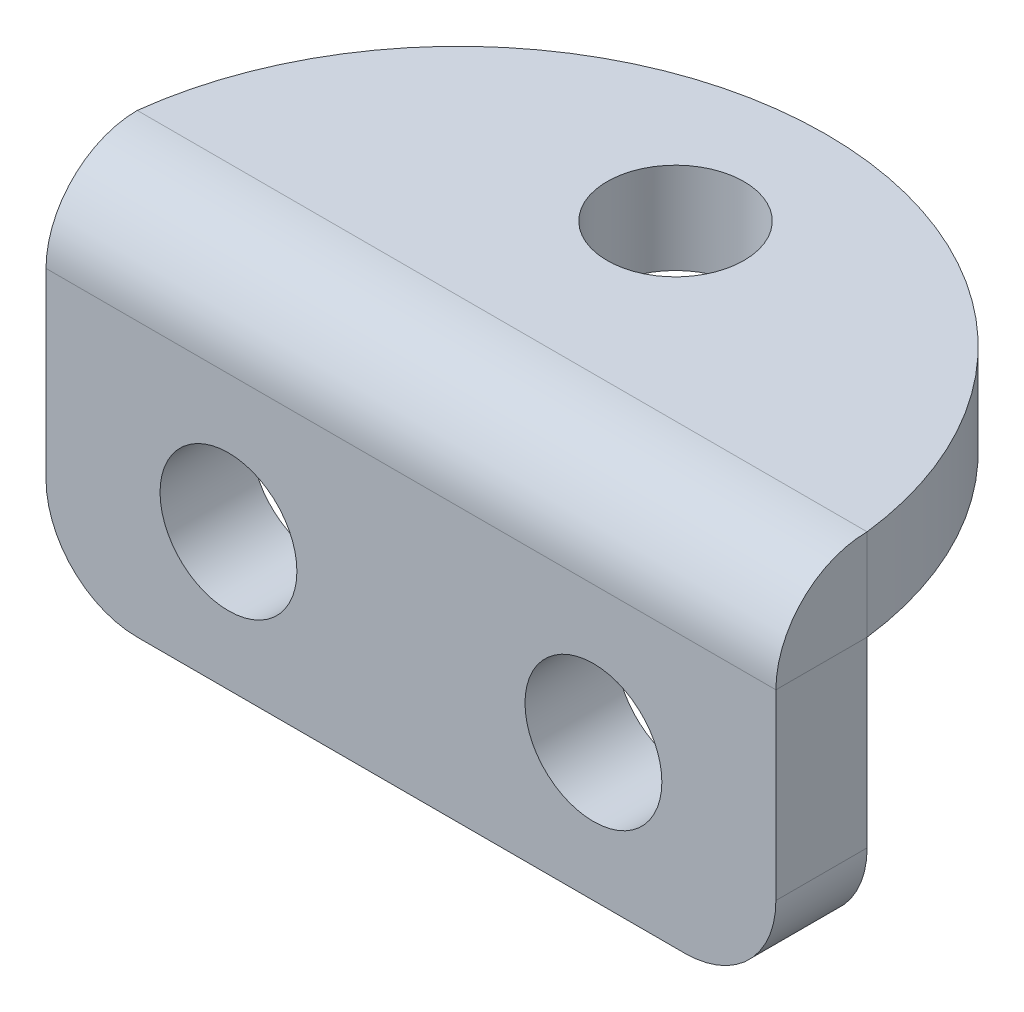
ISO-10303-21;
HEADER;
FILE_DESCRIPTION(('STEP AP214'),'2;1');
FILE_NAME('part.step','',(''),(''),'','','');
FILE_SCHEMA(('AUTOMOTIVE_DESIGN { 1 0 10303 214 1 1 1 1 }'));
ENDSEC;
DATA;
#1=APPLICATION_CONTEXT('core data for automotive mechanical design processes');
#2=APPLICATION_PROTOCOL_DEFINITION('international standard','automotive_design',2000,#1);
#3=PRODUCT_CONTEXT('',#1,'mechanical');
#4=PRODUCT('Part','Part','',(#3));
#5=PRODUCT_RELATED_PRODUCT_CATEGORY('part','',(#4));
#6=PRODUCT_DEFINITION_FORMATION('','',#4);
#7=PRODUCT_DEFINITION_CONTEXT('part definition',#1,'design');
#8=PRODUCT_DEFINITION('design','',#6,#7);
#9=PRODUCT_DEFINITION_SHAPE('','',#8);
#10=(LENGTH_UNIT() NAMED_UNIT(*) SI_UNIT(.MILLI.,.METRE.));
#11=(NAMED_UNIT(*) PLANE_ANGLE_UNIT() SI_UNIT($,.RADIAN.));
#12=(NAMED_UNIT(*) SI_UNIT($,.STERADIAN.) SOLID_ANGLE_UNIT());
#13=UNCERTAINTY_MEASURE_WITH_UNIT(LENGTH_MEASURE(1.E-05),#10,'distance_accuracy_value','');
#14=(GEOMETRIC_REPRESENTATION_CONTEXT(3) GLOBAL_UNCERTAINTY_ASSIGNED_CONTEXT((#13)) GLOBAL_UNIT_ASSIGNED_CONTEXT((#10,
#11,#12)) REPRESENTATION_CONTEXT('',''));
#15=CARTESIAN_POINT('',(0.,0.,0.));
#16=DIRECTION('',(0.,0.,1.));
#17=DIRECTION('',(1.,0.,0.));
#18=AXIS2_PLACEMENT_3D('',#15,#16,#17);
#19=CARTESIAN_POINT('',(0.,2.,0.));
#20=DIRECTION('',(1.,0.,0.));
#21=DIRECTION('',(0.,1.,0.));
#22=AXIS2_PLACEMENT_3D('',#19,#20,#21);
#23=PLANE('',#22);
#24=CARTESIAN_POINT('',(0.,0.,0.));
#25=DIRECTION('',(-1.,0.,0.));
#26=DIRECTION('',(0.,0.,-1.));
#27=AXIS2_PLACEMENT_3D('',#24,#25,#26);
#28=CIRCLE('',#27,2.);
#29=CARTESIAN_POINT('',(0.,0.,2.));
#30=VERTEX_POINT('',#29);
#31=CARTESIAN_POINT('',(0.,2.,0.));
#32=VERTEX_POINT('',#31);
#33=EDGE_CURVE('E74',#30,#32,#28,.T.);
#34=ORIENTED_EDGE('',*,*,#33,.T.);
#35=DIRECTION('',(0.,-1.,0.));
#36=VECTOR('',#35,1.);
#37=CARTESIAN_POINT('',(0.,2.,0.));
#38=LINE('',#37,#36);
#39=CARTESIAN_POINT('',(0.,0.,0.));
#40=VERTEX_POINT('',#39);
#41=EDGE_CURVE('E12',#32,#40,#38,.T.);
#42=ORIENTED_EDGE('',*,*,#41,.T.);
#43=DIRECTION('',(0.,0.,1.));
#44=VECTOR('',#43,1.);
#45=CARTESIAN_POINT('',(0.,0.,0.));
#46=LINE('',#45,#44);
#47=EDGE_CURVE('E115',#40,#30,#46,.T.);
#48=ORIENTED_EDGE('',*,*,#47,.T.);
#49=EDGE_LOOP('',(#34,#42,#48));
#50=FACE_BOUND('',#49,.T.);
#51=ADVANCED_FACE('F50',(#50),#23,.F.);
#52=CARTESIAN_POINT('',(16.,2.,2.));
#53=DIRECTION('',(-1.,0.,0.));
#54=DIRECTION('',(0.,-1.,0.));
#55=AXIS2_PLACEMENT_3D('',#52,#53,#54);
#56=PLANE('',#55);
#57=CARTESIAN_POINT('',(16.,0.,0.));
#58=DIRECTION('',(-1.,0.,0.));
#59=DIRECTION('',(0.,0.,-1.));
#60=AXIS2_PLACEMENT_3D('',#57,#58,#59);
#61=CIRCLE('',#60,2.);
#62=CARTESIAN_POINT('',(16.,0.,2.));
#63=VERTEX_POINT('',#62);
#64=CARTESIAN_POINT('',(16.,2.,0.));
#65=VERTEX_POINT('',#64);
#66=EDGE_CURVE('E85',#63,#65,#61,.T.);
#67=ORIENTED_EDGE('',*,*,#66,.F.);
#68=DIRECTION('',(0.,0.,-1.));
#69=VECTOR('',#68,1.);
#70=CARTESIAN_POINT('',(16.,0.,2.));
#71=LINE('',#70,#69);
#72=CARTESIAN_POINT('',(16.,0.,0.));
#73=VERTEX_POINT('',#72);
#74=EDGE_CURVE('E66',#63,#73,#71,.T.);
#75=ORIENTED_EDGE('',*,*,#74,.T.);
#76=DIRECTION('',(0.,-1.,0.));
#77=VECTOR('',#76,1.);
#78=CARTESIAN_POINT('',(16.,2.,0.));
#79=LINE('',#78,#77);
#80=EDGE_CURVE('E59',#65,#73,#79,.T.);
#81=ORIENTED_EDGE('',*,*,#80,.F.);
#82=EDGE_LOOP('',(#67,#75,#81));
#83=FACE_BOUND('',#82,.T.);
#84=ADVANCED_FACE('F102',(#83),#56,.F.);
#85=CARTESIAN_POINT('',(8.,2.,0.959848869791568));
#86=DIRECTION('',(0.,-1.,0.));
#87=DIRECTION('',(1.,0.,0.));
#88=AXIS2_PLACEMENT_3D('',#85,#86,#87);
#89=PLANE('',#88);
#90=CARTESIAN_POINT('',(8.,2.,-3.8));
#91=DIRECTION('',(0.,-1.,0.));
#92=DIRECTION('',(1.,0.,0.));
#93=AXIS2_PLACEMENT_3D('',#90,#91,#92);
#94=CIRCLE('',#93,1.5);
#95=CARTESIAN_POINT('',(9.5,2.,-3.8));
#96=VERTEX_POINT('',#95);
#97=EDGE_CURVE('E121',#96,#96,#94,.F.);
#98=ORIENTED_EDGE('',*,*,#97,.F.);
#99=EDGE_LOOP('',(#98));
#100=FACE_BOUND('',#99,.T.);
#101=DIRECTION('',(-1.,0.,0.));
#102=VECTOR('',#101,1.);
#103=CARTESIAN_POINT('',(16.,2.,0.));
#104=LINE('',#103,#102);
#105=EDGE_CURVE('E88',#65,#32,#104,.T.);
#106=ORIENTED_EDGE('',*,*,#105,.F.);
#107=CARTESIAN_POINT('',(8.,2.,0.959848869791568));
#108=DIRECTION('',(0.,1.,0.));
#109=DIRECTION('',(1.,0.,0.));
#110=AXIS2_PLACEMENT_3D('',#107,#108,#109);
#111=CIRCLE('',#110,8.05737611464428);
#112=EDGE_CURVE('E97',#65,#32,#111,.T.);
#113=ORIENTED_EDGE('',*,*,#112,.T.);
#114=EDGE_LOOP('',(#106,#113));
#115=FACE_BOUND('',#114,.T.);
#116=ADVANCED_FACE('F95',(#100,#115),#89,.F.);
#117=CARTESIAN_POINT('',(8.,2.,0.959848869791568));
#118=DIRECTION('',(0.,-1.,0.));
#119=DIRECTION('',(1.,0.,0.));
#120=AXIS2_PLACEMENT_3D('',#117,#118,#119);
#121=CYLINDRICAL_SURFACE('',#120,8.05737611464428);
#122=CARTESIAN_POINT('',(8.,0.,0.959848869791568));
#123=DIRECTION('',(0.,1.,0.));
#124=DIRECTION('',(1.,0.,0.));
#125=AXIS2_PLACEMENT_3D('',#122,#123,#124);
#126=CIRCLE('',#125,8.05737611464428);
#127=EDGE_CURVE('E100',#73,#40,#126,.T.);
#128=ORIENTED_EDGE('',*,*,#127,.T.);
#129=ORIENTED_EDGE('',*,*,#41,.F.);
#130=ORIENTED_EDGE('',*,*,#112,.F.);
#131=ORIENTED_EDGE('',*,*,#80,.T.);
#132=EDGE_LOOP('',(#128,#129,#130,#131));
#133=FACE_BOUND('',#132,.T.);
#134=ADVANCED_FACE('F52',(#133),#121,.T.);
#135=CARTESIAN_POINT('',(8.,0.,0.959848869791568));
#136=DIRECTION('',(0.,-1.,0.));
#137=DIRECTION('',(1.,0.,0.));
#138=AXIS2_PLACEMENT_3D('',#135,#136,#137);
#139=PLANE('',#138);
#140=CARTESIAN_POINT('',(8.,0.,-3.8));
#141=DIRECTION('',(0.,1.,0.));
#142=DIRECTION('',(0.,0.,1.));
#143=AXIS2_PLACEMENT_3D('',#140,#141,#142);
#144=CIRCLE('',#143,1.5);
#145=CARTESIAN_POINT('',(8.,0.,-2.3));
#146=VERTEX_POINT('',#145);
#147=EDGE_CURVE('E124',#146,#146,#144,.T.);
#148=ORIENTED_EDGE('',*,*,#147,.T.);
#149=EDGE_LOOP('',(#148));
#150=FACE_BOUND('',#149,.T.);
#151=ORIENTED_EDGE('',*,*,#127,.F.);
#152=ORIENTED_EDGE('',*,*,#74,.F.);
#153=DIRECTION('',(1.,0.,0.));
#154=VECTOR('',#153,1.);
#155=CARTESIAN_POINT('',(0.,0.,2.));
#156=LINE('',#155,#154);
#157=EDGE_CURVE('E90',#30,#63,#156,.T.);
#158=ORIENTED_EDGE('',*,*,#157,.F.);
#159=ORIENTED_EDGE('',*,*,#47,.F.);
#160=EDGE_LOOP('',(#151,#152,#158,#159));
#161=FACE_BOUND('',#160,.T.);
#162=ADVANCED_FACE('F130',(#150,#161),#139,.T.);
#163=CARTESIAN_POINT('',(16.,0.,0.));
#164=DIRECTION('',(-1.,0.,0.));
#165=DIRECTION('',(0.,0.,1.));
#166=AXIS2_PLACEMENT_3D('',#163,#164,#165);
#167=CYLINDRICAL_SURFACE('',#166,2.);
#168=ORIENTED_EDGE('',*,*,#33,.F.);
#169=ORIENTED_EDGE('',*,*,#157,.T.);
#170=ORIENTED_EDGE('',*,*,#66,.T.);
#171=ORIENTED_EDGE('',*,*,#105,.T.);
#172=EDGE_LOOP('',(#168,#169,#170,#171));
#173=FACE_BOUND('',#172,.T.);
#174=ADVANCED_FACE('F87',(#173),#167,.T.);
#175=CARTESIAN_POINT('',(8.,16.,-3.8));
#176=DIRECTION('',(0.,-1.,0.));
#177=DIRECTION('',(0.,0.,-1.));
#178=AXIS2_PLACEMENT_3D('',#175,#176,#177);
#179=CYLINDRICAL_SURFACE('',#178,1.5);
#180=ORIENTED_EDGE('',*,*,#147,.F.);
#181=EDGE_LOOP('',(#180));
#182=FACE_BOUND('',#181,.T.);
#183=ORIENTED_EDGE('',*,*,#97,.T.);
#184=EDGE_LOOP('',(#183));
#185=FACE_BOUND('',#184,.T.);
#186=ADVANCED_FACE('F133',(#182,#185),#179,.F.);
#187=CLOSED_SHELL('',(#51,#84,#116,#134,#162,#174,#186));
#188=MANIFOLD_SOLID_BREP('B2',#187);
#189=CARTESIAN_POINT('',(16.,0.,2.));
#190=DIRECTION('',(0.,-1.,0.));
#191=DIRECTION('',(1.,0.,0.));
#192=AXIS2_PLACEMENT_3D('',#189,#190,#191);
#193=PLANE('',#192);
#194=DIRECTION('',(-1.,0.,0.));
#195=VECTOR('',#194,1.);
#196=CARTESIAN_POINT('',(16.,0.,0.));
#197=LINE('',#196,#195);
#198=CARTESIAN_POINT('',(16.,0.,0.));
#199=VERTEX_POINT('',#198);
#200=CARTESIAN_POINT('',(0.,0.,0.));
#201=VERTEX_POINT('',#200);
#202=EDGE_CURVE('E278',#199,#201,#197,.T.);
#203=ORIENTED_EDGE('',*,*,#202,.T.);
#204=DIRECTION('',(0.,0.,-1.));
#205=VECTOR('',#204,1.);
#206=CARTESIAN_POINT('',(0.,0.,2.));
#207=LINE('',#206,#205);
#208=CARTESIAN_POINT('',(0.,0.,2.));
#209=VERTEX_POINT('',#208);
#210=EDGE_CURVE('E48',#209,#201,#207,.T.);
#211=ORIENTED_EDGE('',*,*,#210,.F.);
#212=DIRECTION('',(-1.,0.,0.));
#213=VECTOR('',#212,1.);
#214=CARTESIAN_POINT('',(16.,0.,2.));
#215=LINE('',#214,#213);
#216=CARTESIAN_POINT('',(16.,0.,2.));
#217=VERTEX_POINT('',#216);
#218=EDGE_CURVE('E289',#217,#209,#215,.T.);
#219=ORIENTED_EDGE('',*,*,#218,.F.);
#220=DIRECTION('',(0.,0.,-1.));
#221=VECTOR('',#220,1.);
#222=CARTESIAN_POINT('',(16.,0.,2.));
#223=LINE('',#222,#221);
#224=EDGE_CURVE('E274',#217,#199,#223,.T.);
#225=ORIENTED_EDGE('',*,*,#224,.T.);
#226=EDGE_LOOP('',(#203,#211,#219,#225));
#227=FACE_BOUND('',#226,.T.);
#228=ADVANCED_FACE('F194',(#227),#193,.F.);
#229=CARTESIAN_POINT('',(0.,0.,2.));
#230=DIRECTION('',(1.,0.,0.));
#231=DIRECTION('',(0.,1.,0.));
#232=AXIS2_PLACEMENT_3D('',#229,#230,#231);
#233=PLANE('',#232);
#234=DIRECTION('',(0.,-1.,0.));
#235=VECTOR('',#234,1.);
#236=CARTESIAN_POINT('',(0.,0.,0.));
#237=LINE('',#236,#235);
#238=CARTESIAN_POINT('',(0.,-4.,0.));
#239=VERTEX_POINT('',#238);
#240=EDGE_CURVE('E281',#201,#239,#237,.T.);
#241=ORIENTED_EDGE('',*,*,#240,.T.);
#242=DIRECTION('',(0.,0.,-1.));
#243=VECTOR('',#242,1.);
#244=CARTESIAN_POINT('',(0.,-4.,2.));
#245=LINE('',#244,#243);
#246=CARTESIAN_POINT('',(0.,-4.,2.));
#247=VERTEX_POINT('',#246);
#248=EDGE_CURVE('E202',#247,#239,#245,.T.);
#249=ORIENTED_EDGE('',*,*,#248,.F.);
#250=DIRECTION('',(0.,-1.,0.));
#251=VECTOR('',#250,1.);
#252=CARTESIAN_POINT('',(0.,0.,2.));
#253=LINE('',#252,#251);
#254=EDGE_CURVE('E247',#209,#247,#253,.T.);
#255=ORIENTED_EDGE('',*,*,#254,.F.);
#256=ORIENTED_EDGE('',*,*,#210,.T.);
#257=EDGE_LOOP('',(#241,#249,#255,#256));
#258=FACE_BOUND('',#257,.T.);
#259=ADVANCED_FACE('F314',(#258),#233,.F.);
#260=CARTESIAN_POINT('',(2.,-4.,2.));
#261=DIRECTION('',(0.,0.,-1.));
#262=DIRECTION('',(-1.,0.,0.));
#263=AXIS2_PLACEMENT_3D('',#260,#261,#262);
#264=CYLINDRICAL_SURFACE('',#263,2.);
#265=CARTESIAN_POINT('',(2.,-4.,0.));
#266=DIRECTION('',(0.,0.,1.));
#267=DIRECTION('',(1.,0.,0.));
#268=AXIS2_PLACEMENT_3D('',#265,#266,#267);
#269=CIRCLE('',#268,2.);
#270=CARTESIAN_POINT('',(2.,-6.,0.));
#271=VERTEX_POINT('',#270);
#272=EDGE_CURVE('E284',#239,#271,#269,.T.);
#273=ORIENTED_EDGE('',*,*,#272,.T.);
#274=DIRECTION('',(0.,0.,-1.));
#275=VECTOR('',#274,1.);
#276=CARTESIAN_POINT('',(2.,-6.,2.));
#277=LINE('',#276,#275);
#278=CARTESIAN_POINT('',(2.,-6.,2.));
#279=VERTEX_POINT('',#278);
#280=EDGE_CURVE('E269',#279,#271,#277,.T.);
#281=ORIENTED_EDGE('',*,*,#280,.F.);
#282=CARTESIAN_POINT('',(2.,-4.,2.));
#283=DIRECTION('',(0.,0.,1.));
#284=DIRECTION('',(1.,0.,0.));
#285=AXIS2_PLACEMENT_3D('',#282,#283,#284);
#286=CIRCLE('',#285,2.);
#287=EDGE_CURVE('E260',#247,#279,#286,.T.);
#288=ORIENTED_EDGE('',*,*,#287,.F.);
#289=ORIENTED_EDGE('',*,*,#248,.T.);
#290=EDGE_LOOP('',(#273,#281,#288,#289));
#291=FACE_BOUND('',#290,.T.);
#292=ADVANCED_FACE('F295',(#291),#264,.T.);
#293=CARTESIAN_POINT('',(2.,-6.,2.));
#294=DIRECTION('',(0.,1.,0.));
#295=DIRECTION('',(0.,0.,1.));
#296=AXIS2_PLACEMENT_3D('',#293,#294,#295);
#297=PLANE('',#296);
#298=DIRECTION('',(1.,0.,0.));
#299=VECTOR('',#298,1.);
#300=CARTESIAN_POINT('',(2.,-6.,0.));
#301=LINE('',#300,#299);
#302=CARTESIAN_POINT('',(14.,-6.,0.));
#303=VERTEX_POINT('',#302);
#304=EDGE_CURVE('E268',#271,#303,#301,.T.);
#305=ORIENTED_EDGE('',*,*,#304,.T.);
#306=DIRECTION('',(0.,0.,-1.));
#307=VECTOR('',#306,1.);
#308=CARTESIAN_POINT('',(14.,-6.,2.));
#309=LINE('',#308,#307);
#310=CARTESIAN_POINT('',(14.,-6.,2.));
#311=VERTEX_POINT('',#310);
#312=EDGE_CURVE('E265',#311,#303,#309,.T.);
#313=ORIENTED_EDGE('',*,*,#312,.F.);
#314=DIRECTION('',(1.,0.,0.));
#315=VECTOR('',#314,1.);
#316=CARTESIAN_POINT('',(2.,-6.,2.));
#317=LINE('',#316,#315);
#318=EDGE_CURVE('E254',#279,#311,#317,.T.);
#319=ORIENTED_EDGE('',*,*,#318,.F.);
#320=ORIENTED_EDGE('',*,*,#280,.T.);
#321=EDGE_LOOP('',(#305,#313,#319,#320));
#322=FACE_BOUND('',#321,.T.);
#323=ADVANCED_FACE('F266',(#322),#297,.F.);
#324=CARTESIAN_POINT('',(14.,-4.,2.));
#325=DIRECTION('',(0.,0.,-1.));
#326=DIRECTION('',(-1.,0.,0.));
#327=AXIS2_PLACEMENT_3D('',#324,#325,#326);
#328=CYLINDRICAL_SURFACE('',#327,2.);
#329=CARTESIAN_POINT('',(14.,-4.,0.));
#330=DIRECTION('',(0.,0.,1.));
#331=DIRECTION('',(-1.,0.,0.));
#332=AXIS2_PLACEMENT_3D('',#329,#330,#331);
#333=CIRCLE('',#332,2.);
#334=CARTESIAN_POINT('',(16.,-4.,0.));
#335=VERTEX_POINT('',#334);
#336=EDGE_CURVE('E233',#303,#335,#333,.T.);
#337=ORIENTED_EDGE('',*,*,#336,.T.);
#338=DIRECTION('',(0.,0.,-1.));
#339=VECTOR('',#338,1.);
#340=CARTESIAN_POINT('',(16.,-4.,2.));
#341=LINE('',#340,#339);
#342=CARTESIAN_POINT('',(16.,-4.,2.));
#343=VERTEX_POINT('',#342);
#344=EDGE_CURVE('E270',#343,#335,#341,.T.);
#345=ORIENTED_EDGE('',*,*,#344,.F.);
#346=CARTESIAN_POINT('',(14.,-4.,2.));
#347=DIRECTION('',(0.,0.,1.));
#348=DIRECTION('',(-1.,0.,0.));
#349=AXIS2_PLACEMENT_3D('',#346,#347,#348);
#350=CIRCLE('',#349,2.);
#351=EDGE_CURVE('E258',#311,#343,#350,.T.);
#352=ORIENTED_EDGE('',*,*,#351,.F.);
#353=ORIENTED_EDGE('',*,*,#312,.T.);
#354=EDGE_LOOP('',(#337,#345,#352,#353));
#355=FACE_BOUND('',#354,.T.);
#356=ADVANCED_FACE('F272',(#355),#328,.T.);
#357=CARTESIAN_POINT('',(16.,-4.,2.));
#358=DIRECTION('',(-1.,0.,0.));
#359=DIRECTION('',(0.,0.,1.));
#360=AXIS2_PLACEMENT_3D('',#357,#358,#359);
#361=PLANE('',#360);
#362=DIRECTION('',(0.,1.,0.));
#363=VECTOR('',#362,1.);
#364=CARTESIAN_POINT('',(16.,-4.,0.));
#365=LINE('',#364,#363);
#366=EDGE_CURVE('E239',#335,#199,#365,.T.);
#367=ORIENTED_EDGE('',*,*,#366,.T.);
#368=ORIENTED_EDGE('',*,*,#224,.F.);
#369=DIRECTION('',(0.,1.,0.));
#370=VECTOR('',#369,1.);
#371=CARTESIAN_POINT('',(16.,-4.,2.));
#372=LINE('',#371,#370);
#373=EDGE_CURVE('E210',#343,#217,#372,.T.);
#374=ORIENTED_EDGE('',*,*,#373,.F.);
#375=ORIENTED_EDGE('',*,*,#344,.T.);
#376=EDGE_LOOP('',(#367,#368,#374,#375));
#377=FACE_BOUND('',#376,.T.);
#378=ADVANCED_FACE('F302',(#377),#361,.F.);
#379=CARTESIAN_POINT('',(2.,-4.,2.));
#380=DIRECTION('',(0.,0.,1.));
#381=DIRECTION('',(1.,0.,0.));
#382=AXIS2_PLACEMENT_3D('',#379,#380,#381);
#383=PLANE('',#382);
#384=CARTESIAN_POINT('',(12.,-3.,2.));
#385=DIRECTION('',(0.,0.,1.));
#386=DIRECTION('',(1.,0.,0.));
#387=AXIS2_PLACEMENT_3D('',#384,#385,#386);
#388=CIRCLE('',#387,1.5);
#389=CARTESIAN_POINT('',(13.5,-3.,2.));
#390=VERTEX_POINT('',#389);
#391=EDGE_CURVE('E282',#390,#390,#388,.T.);
#392=ORIENTED_EDGE('',*,*,#391,.F.);
#393=EDGE_LOOP('',(#392));
#394=FACE_BOUND('',#393,.T.);
#395=CARTESIAN_POINT('',(4.,-3.,2.));
#396=DIRECTION('',(0.,0.,1.));
#397=DIRECTION('',(1.,0.,0.));
#398=AXIS2_PLACEMENT_3D('',#395,#396,#397);
#399=CIRCLE('',#398,1.5);
#400=CARTESIAN_POINT('',(5.5,-3.,2.));
#401=VERTEX_POINT('',#400);
#402=EDGE_CURVE('E380',#401,#401,#399,.T.);
#403=ORIENTED_EDGE('',*,*,#402,.F.);
#404=EDGE_LOOP('',(#403));
#405=FACE_BOUND('',#404,.T.);
#406=ORIENTED_EDGE('',*,*,#218,.T.);
#407=ORIENTED_EDGE('',*,*,#254,.T.);
#408=ORIENTED_EDGE('',*,*,#287,.T.);
#409=ORIENTED_EDGE('',*,*,#318,.T.);
#410=ORIENTED_EDGE('',*,*,#351,.T.);
#411=ORIENTED_EDGE('',*,*,#373,.T.);
#412=EDGE_LOOP('',(#406,#407,#408,#409,#410,#411));
#413=FACE_BOUND('',#412,.T.);
#414=ADVANCED_FACE('F256',(#394,#405,#413),#383,.T.);
#415=CARTESIAN_POINT('',(2.,-4.,0.));
#416=DIRECTION('',(0.,0.,1.));
#417=DIRECTION('',(1.,0.,0.));
#418=AXIS2_PLACEMENT_3D('',#415,#416,#417);
#419=PLANE('',#418);
#420=CARTESIAN_POINT('',(12.,-3.,0.));
#421=DIRECTION('',(0.,0.,-1.));
#422=DIRECTION('',(-1.,0.,0.));
#423=AXIS2_PLACEMENT_3D('',#420,#421,#422);
#424=CIRCLE('',#423,1.5);
#425=CARTESIAN_POINT('',(10.5,-3.,0.));
#426=VERTEX_POINT('',#425);
#427=EDGE_CURVE('E379',#426,#426,#424,.T.);
#428=ORIENTED_EDGE('',*,*,#427,.F.);
#429=EDGE_LOOP('',(#428));
#430=FACE_BOUND('',#429,.T.);
#431=CARTESIAN_POINT('',(4.,-3.,0.));
#432=DIRECTION('',(0.,0.,-1.));
#433=DIRECTION('',(-1.,0.,0.));
#434=AXIS2_PLACEMENT_3D('',#431,#432,#433);
#435=CIRCLE('',#434,1.5);
#436=CARTESIAN_POINT('',(2.5,-3.,0.));
#437=VERTEX_POINT('',#436);
#438=EDGE_CURVE('E381',#437,#437,#435,.T.);
#439=ORIENTED_EDGE('',*,*,#438,.F.);
#440=EDGE_LOOP('',(#439));
#441=FACE_BOUND('',#440,.T.);
#442=ORIENTED_EDGE('',*,*,#202,.F.);
#443=ORIENTED_EDGE('',*,*,#366,.F.);
#444=ORIENTED_EDGE('',*,*,#336,.F.);
#445=ORIENTED_EDGE('',*,*,#304,.F.);
#446=ORIENTED_EDGE('',*,*,#272,.F.);
#447=ORIENTED_EDGE('',*,*,#240,.F.);
#448=EDGE_LOOP('',(#442,#443,#444,#445,#446,#447));
#449=FACE_BOUND('',#448,.T.);
#450=ADVANCED_FACE('F298',(#430,#441,#449),#419,.F.);
#451=CARTESIAN_POINT('',(4.,-3.,6.));
#452=DIRECTION('',(0.,0.,-1.));
#453=DIRECTION('',(-1.,0.,0.));
#454=AXIS2_PLACEMENT_3D('',#451,#452,#453);
#455=CYLINDRICAL_SURFACE('',#454,1.5);
#456=ORIENTED_EDGE('',*,*,#402,.T.);
#457=EDGE_LOOP('',(#456));
#458=FACE_BOUND('',#457,.T.);
#459=ORIENTED_EDGE('',*,*,#438,.T.);
#460=EDGE_LOOP('',(#459));
#461=FACE_BOUND('',#460,.T.);
#462=ADVANCED_FACE('F351',(#458,#461),#455,.F.);
#463=CARTESIAN_POINT('',(12.,-3.,6.));
#464=DIRECTION('',(0.,0.,-1.));
#465=DIRECTION('',(-1.,0.,0.));
#466=AXIS2_PLACEMENT_3D('',#463,#464,#465);
#467=CYLINDRICAL_SURFACE('',#466,1.5);
#468=ORIENTED_EDGE('',*,*,#391,.T.);
#469=EDGE_LOOP('',(#468));
#470=FACE_BOUND('',#469,.T.);
#471=ORIENTED_EDGE('',*,*,#427,.T.);
#472=EDGE_LOOP('',(#471));
#473=FACE_BOUND('',#472,.T.);
#474=ADVANCED_FACE('F360',(#470,#473),#467,.F.);
#475=CLOSED_SHELL('',(#228,#259,#292,#323,#356,#378,#414,#450,#462,#474));
#476=MANIFOLD_SOLID_BREP('B6',#475);
#477=ADVANCED_BREP_SHAPE_REPRESENTATION('',(#18,#188,#476),#14);
#478=SHAPE_DEFINITION_REPRESENTATION(#9,#477);
ENDSEC;
END-ISO-10303-21;
